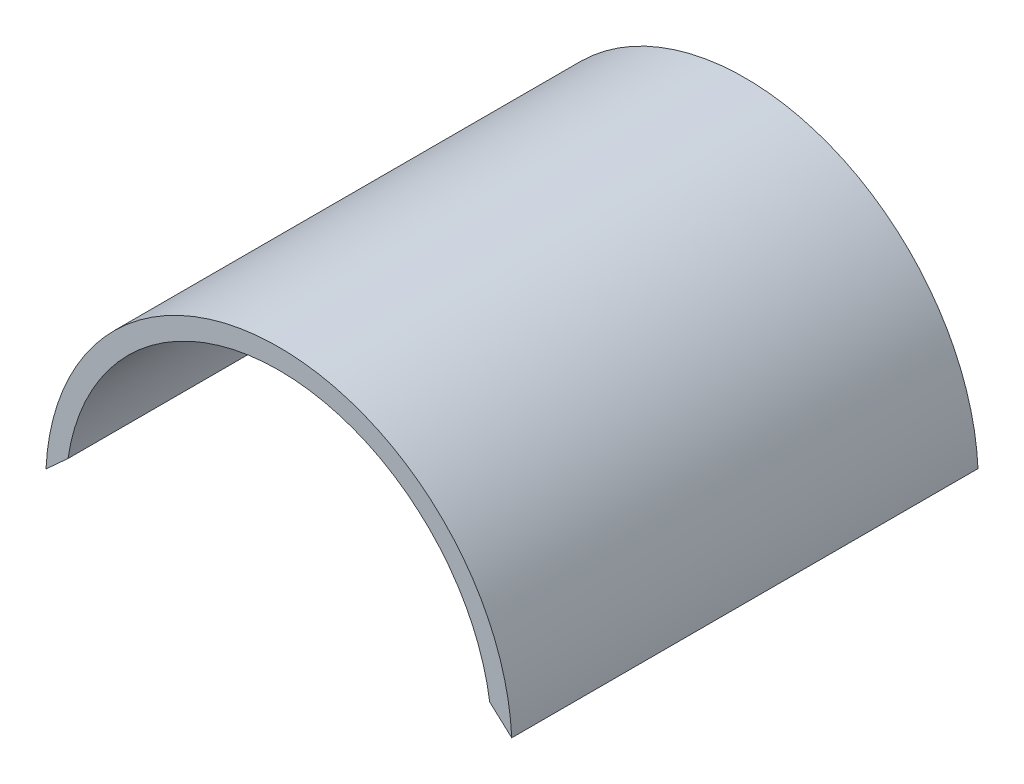
ISO-10303-21;
HEADER;
FILE_DESCRIPTION(('STEP AP214'),'2;1');
FILE_NAME('part.step','',(''),(''),'','','');
FILE_SCHEMA(('AUTOMOTIVE_DESIGN { 1 0 10303 214 1 1 1 1 }'));
ENDSEC;
DATA;
#1=APPLICATION_CONTEXT('core data for automotive mechanical design processes');
#2=APPLICATION_PROTOCOL_DEFINITION('international standard','automotive_design',2000,#1);
#3=PRODUCT_CONTEXT('',#1,'mechanical');
#4=PRODUCT('Part','Part','',(#3));
#5=PRODUCT_RELATED_PRODUCT_CATEGORY('part','',(#4));
#6=PRODUCT_DEFINITION_FORMATION('','',#4);
#7=PRODUCT_DEFINITION_CONTEXT('part definition',#1,'design');
#8=PRODUCT_DEFINITION('design','',#6,#7);
#9=PRODUCT_DEFINITION_SHAPE('','',#8);
#10=(LENGTH_UNIT() NAMED_UNIT(*) SI_UNIT(.MILLI.,.METRE.));
#11=(NAMED_UNIT(*) PLANE_ANGLE_UNIT() SI_UNIT($,.RADIAN.));
#12=(NAMED_UNIT(*) SI_UNIT($,.STERADIAN.) SOLID_ANGLE_UNIT());
#13=UNCERTAINTY_MEASURE_WITH_UNIT(LENGTH_MEASURE(1.E-05),#10,'distance_accuracy_value','');
#14=(GEOMETRIC_REPRESENTATION_CONTEXT(3) GLOBAL_UNCERTAINTY_ASSIGNED_CONTEXT((#13)) GLOBAL_UNIT_ASSIGNED_CONTEXT((#10,
#11,#12)) REPRESENTATION_CONTEXT('',''));
#15=CARTESIAN_POINT('',(0.,0.,0.));
#16=DIRECTION('',(0.,0.,1.));
#17=DIRECTION('',(1.,0.,0.));
#18=AXIS2_PLACEMENT_3D('',#15,#16,#17);
#19=CARTESIAN_POINT('',(0.,0.,88.9));
#20=DIRECTION('',(0.,0.,-1.));
#21=DIRECTION('',(-1.,0.,0.));
#22=AXIS2_PLACEMENT_3D('',#19,#20,#21);
#23=CYLINDRICAL_SURFACE('',#22,40.64);
#24=CARTESIAN_POINT('',(0.,0.,0.));
#25=DIRECTION('',(0.,0.,-1.));
#26=DIRECTION('',(1.,0.,0.));
#27=AXIS2_PLACEMENT_3D('',#24,#25,#26);
#28=CIRCLE('',#27,40.64);
#29=CARTESIAN_POINT('',(-40.2038837694651,5.93778829627168,0.));
#30=VERTEX_POINT('',#29);
#31=CARTESIAN_POINT('',(40.2038837694651,5.93778829627168,0.));
#32=VERTEX_POINT('',#31);
#33=EDGE_CURVE('E98',#30,#32,#28,.T.);
#34=ORIENTED_EDGE('',*,*,#33,.T.);
#35=DIRECTION('',(0.,0.,-1.));
#36=VECTOR('',#35,1.);
#37=CARTESIAN_POINT('',(40.2038837694651,5.93778829627168,88.9));
#38=LINE('',#37,#36);
#39=CARTESIAN_POINT('',(40.2038837694651,5.93778829627168,88.9));
#40=VERTEX_POINT('',#39);
#41=EDGE_CURVE('E11',#40,#32,#38,.T.);
#42=ORIENTED_EDGE('',*,*,#41,.F.);
#43=CARTESIAN_POINT('',(0.,0.,88.9));
#44=DIRECTION('',(0.,0.,-1.));
#45=DIRECTION('',(1.,0.,0.));
#46=AXIS2_PLACEMENT_3D('',#43,#44,#45);
#47=CIRCLE('',#46,40.64);
#48=CARTESIAN_POINT('',(-40.2038837694651,5.93778829627168,88.9));
#49=VERTEX_POINT('',#48);
#50=EDGE_CURVE('E86',#49,#40,#47,.T.);
#51=ORIENTED_EDGE('',*,*,#50,.F.);
#52=DIRECTION('',(0.,0.,-1.));
#53=VECTOR('',#52,1.);
#54=CARTESIAN_POINT('',(-40.2038837694651,5.93778829627168,88.9));
#55=LINE('',#54,#53);
#56=EDGE_CURVE('E94',#49,#30,#55,.T.);
#57=ORIENTED_EDGE('',*,*,#56,.T.);
#58=EDGE_LOOP('',(#34,#42,#51,#57));
#59=FACE_BOUND('',#58,.T.);
#60=ADVANCED_FACE('F35',(#59),#23,.F.);
#61=CARTESIAN_POINT('',(40.2038837694651,5.93778829627168,88.9));
#62=DIRECTION('',(0.672307408747508,0.740272077106257,0.));
#63=DIRECTION('',(-0.740272077106257,0.672307408747508,0.));
#64=AXIS2_PLACEMENT_3D('',#61,#62,#63);
#65=PLANE('',#64);
#66=DIRECTION('',(0.740272077106257,-0.672307408747507,0.));
#67=VECTOR('',#66,1.);
#68=CARTESIAN_POINT('',(40.2038837694651,5.93778829627168,0.));
#69=LINE('',#68,#67);
#70=CARTESIAN_POINT('',(44.39904297354,2.12778829627168,0.));
#71=VERTEX_POINT('',#70);
#72=EDGE_CURVE('E90',#32,#71,#69,.T.);
#73=ORIENTED_EDGE('',*,*,#72,.T.);
#74=DIRECTION('',(0.,0.,-1.));
#75=VECTOR('',#74,1.);
#76=CARTESIAN_POINT('',(44.39904297354,2.12778829627168,88.9));
#77=LINE('',#76,#75);
#78=CARTESIAN_POINT('',(44.39904297354,2.12778829627168,88.9));
#79=VERTEX_POINT('',#78);
#80=EDGE_CURVE('E43',#79,#71,#77,.T.);
#81=ORIENTED_EDGE('',*,*,#80,.F.);
#82=DIRECTION('',(0.740272077106257,-0.672307408747507,0.));
#83=VECTOR('',#82,1.);
#84=CARTESIAN_POINT('',(40.2038837694651,5.93778829627168,88.9));
#85=LINE('',#84,#83);
#86=EDGE_CURVE('E81',#40,#79,#85,.T.);
#87=ORIENTED_EDGE('',*,*,#86,.F.);
#88=ORIENTED_EDGE('',*,*,#41,.T.);
#89=EDGE_LOOP('',(#73,#81,#87,#88));
#90=FACE_BOUND('',#89,.T.);
#91=ADVANCED_FACE('F89',(#90),#65,.F.);
#92=CARTESIAN_POINT('',(0.,0.,88.9));
#93=DIRECTION('',(0.,0.,-1.));
#94=DIRECTION('',(-1.,0.,0.));
#95=AXIS2_PLACEMENT_3D('',#92,#93,#94);
#96=CYLINDRICAL_SURFACE('',#95,44.45);
#97=CARTESIAN_POINT('',(0.,0.,0.));
#98=DIRECTION('',(0.,0.,1.));
#99=DIRECTION('',(1.,0.,0.));
#100=AXIS2_PLACEMENT_3D('',#97,#98,#99);
#101=CIRCLE('',#100,44.45);
#102=CARTESIAN_POINT('',(-44.39904297354,2.12778829627168,0.));
#103=VERTEX_POINT('',#102);
#104=EDGE_CURVE('E68',#71,#103,#101,.T.);
#105=ORIENTED_EDGE('',*,*,#104,.T.);
#106=DIRECTION('',(0.,0.,-1.));
#107=VECTOR('',#106,1.);
#108=CARTESIAN_POINT('',(-44.39904297354,2.12778829627168,88.9));
#109=LINE('',#108,#107);
#110=CARTESIAN_POINT('',(-44.39904297354,2.12778829627168,88.9));
#111=VERTEX_POINT('',#110);
#112=EDGE_CURVE('E91',#111,#103,#109,.T.);
#113=ORIENTED_EDGE('',*,*,#112,.F.);
#114=CARTESIAN_POINT('',(0.,0.,88.9));
#115=DIRECTION('',(0.,0.,1.));
#116=DIRECTION('',(1.,0.,0.));
#117=AXIS2_PLACEMENT_3D('',#114,#115,#116);
#118=CIRCLE('',#117,44.45);
#119=EDGE_CURVE('E84',#79,#111,#118,.T.);
#120=ORIENTED_EDGE('',*,*,#119,.F.);
#121=ORIENTED_EDGE('',*,*,#80,.T.);
#122=EDGE_LOOP('',(#105,#113,#120,#121));
#123=FACE_BOUND('',#122,.T.);
#124=ADVANCED_FACE('F92',(#123),#96,.T.);
#125=CARTESIAN_POINT('',(-40.2038837694651,5.93778829627168,88.9));
#126=DIRECTION('',(-0.672307408747508,0.740272077106257,0.));
#127=DIRECTION('',(-0.740272077106257,-0.672307408747508,0.));
#128=AXIS2_PLACEMENT_3D('',#125,#126,#127);
#129=PLANE('',#128);
#130=DIRECTION('',(0.740272077106257,0.672307408747507,0.));
#131=VECTOR('',#130,1.);
#132=CARTESIAN_POINT('',(-40.2038837694651,5.93778829627168,0.));
#133=LINE('',#132,#131);
#134=EDGE_CURVE('E74',#103,#30,#133,.T.);
#135=ORIENTED_EDGE('',*,*,#134,.T.);
#136=ORIENTED_EDGE('',*,*,#56,.F.);
#137=DIRECTION('',(0.740272077106257,0.672307408747507,0.));
#138=VECTOR('',#137,1.);
#139=CARTESIAN_POINT('',(-40.2038837694651,5.93778829627168,88.9));
#140=LINE('',#139,#138);
#141=EDGE_CURVE('E51',#111,#49,#140,.T.);
#142=ORIENTED_EDGE('',*,*,#141,.F.);
#143=ORIENTED_EDGE('',*,*,#112,.T.);
#144=EDGE_LOOP('',(#135,#136,#142,#143));
#145=FACE_BOUND('',#144,.T.);
#146=ADVANCED_FACE('F105',(#145),#129,.F.);
#147=CARTESIAN_POINT('',(0.,0.,88.9));
#148=DIRECTION('',(0.,0.,1.));
#149=DIRECTION('',(1.,0.,0.));
#150=AXIS2_PLACEMENT_3D('',#147,#148,#149);
#151=PLANE('',#150);
#152=ORIENTED_EDGE('',*,*,#50,.T.);
#153=ORIENTED_EDGE('',*,*,#86,.T.);
#154=ORIENTED_EDGE('',*,*,#119,.T.);
#155=ORIENTED_EDGE('',*,*,#141,.T.);
#156=EDGE_LOOP('',(#152,#153,#154,#155));
#157=FACE_BOUND('',#156,.T.);
#158=ADVANCED_FACE('F82',(#157),#151,.T.);
#159=CARTESIAN_POINT('',(0.,0.,0.));
#160=DIRECTION('',(0.,0.,1.));
#161=DIRECTION('',(1.,0.,0.));
#162=AXIS2_PLACEMENT_3D('',#159,#160,#161);
#163=PLANE('',#162);
#164=ORIENTED_EDGE('',*,*,#33,.F.);
#165=ORIENTED_EDGE('',*,*,#134,.F.);
#166=ORIENTED_EDGE('',*,*,#104,.F.);
#167=ORIENTED_EDGE('',*,*,#72,.F.);
#168=EDGE_LOOP('',(#164,#165,#166,#167));
#169=FACE_BOUND('',#168,.T.);
#170=ADVANCED_FACE('F108',(#169),#163,.F.);
#171=CLOSED_SHELL('',(#60,#91,#124,#146,#158,#170));
#172=MANIFOLD_SOLID_BREP('B2',#171);
#173=ADVANCED_BREP_SHAPE_REPRESENTATION('',(#18,#172),#14);
#174=SHAPE_DEFINITION_REPRESENTATION(#9,#173);
ENDSEC;
END-ISO-10303-21;
